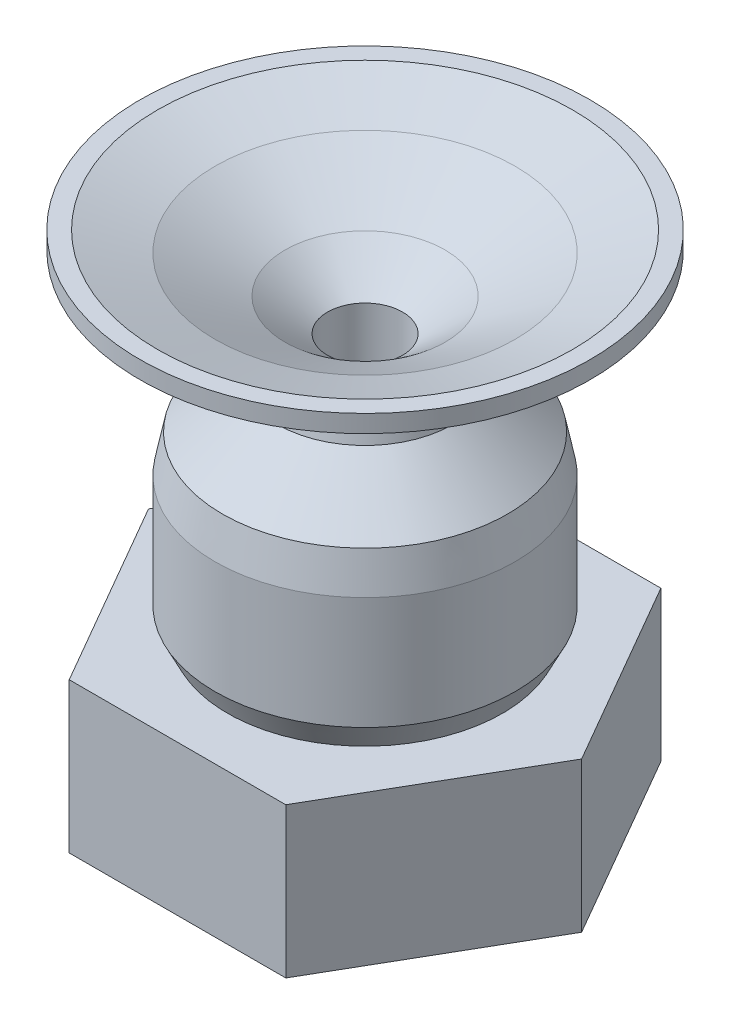
ISO-10303-21;
HEADER;
FILE_DESCRIPTION(('STEP AP214'),'2;1');
FILE_NAME('part.step','',(''),(''),'','','');
FILE_SCHEMA(('AUTOMOTIVE_DESIGN { 1 0 10303 214 1 1 1 1 }'));
ENDSEC;
DATA;
#1=APPLICATION_CONTEXT('core data for automotive mechanical design processes');
#2=APPLICATION_PROTOCOL_DEFINITION('international standard','automotive_design',2000,#1);
#3=PRODUCT_CONTEXT('',#1,'mechanical');
#4=PRODUCT('Part','Part','',(#3));
#5=PRODUCT_RELATED_PRODUCT_CATEGORY('part','',(#4));
#6=PRODUCT_DEFINITION_FORMATION('','',#4);
#7=PRODUCT_DEFINITION_CONTEXT('part definition',#1,'design');
#8=PRODUCT_DEFINITION('design','',#6,#7);
#9=PRODUCT_DEFINITION_SHAPE('','',#8);
#10=(LENGTH_UNIT() NAMED_UNIT(*) SI_UNIT(.MILLI.,.METRE.));
#11=(NAMED_UNIT(*) PLANE_ANGLE_UNIT() SI_UNIT($,.RADIAN.));
#12=(NAMED_UNIT(*) SI_UNIT($,.STERADIAN.) SOLID_ANGLE_UNIT());
#13=UNCERTAINTY_MEASURE_WITH_UNIT(LENGTH_MEASURE(1.E-05),#10,'distance_accuracy_value','');
#14=(GEOMETRIC_REPRESENTATION_CONTEXT(3) GLOBAL_UNCERTAINTY_ASSIGNED_CONTEXT((#13)) GLOBAL_UNIT_ASSIGNED_CONTEXT((#10,
#11,#12)) REPRESENTATION_CONTEXT('',''));
#15=CARTESIAN_POINT('',(0.,0.,0.));
#16=DIRECTION('',(0.,0.,1.));
#17=DIRECTION('',(1.,0.,0.));
#18=AXIS2_PLACEMENT_3D('',#15,#16,#17);
#19=CARTESIAN_POINT('',(0.,0.,0.));
#20=DIRECTION('',(0.,-1.,0.));
#21=DIRECTION('',(0.,0.,-1.));
#22=AXIS2_PLACEMENT_3D('',#19,#20,#21);
#23=CYLINDRICAL_SURFACE('',#22,1.5);
#24=CARTESIAN_POINT('',(0.,6.,0.));
#25=DIRECTION('',(0.,-1.,0.));
#26=DIRECTION('',(0.,0.,-1.));
#27=AXIS2_PLACEMENT_3D('',#24,#25,#26);
#28=CIRCLE('',#27,1.5);
#29=CARTESIAN_POINT('',(0.,6.,-1.5));
#30=VERTEX_POINT('',#29);
#31=EDGE_CURVE('E11',#30,#30,#28,.T.);
#32=ORIENTED_EDGE('',*,*,#31,.T.);
#33=EDGE_LOOP('',(#32));
#34=FACE_BOUND('',#33,.T.);
#35=CARTESIAN_POINT('',(0.,16.4,0.));
#36=DIRECTION('',(0.,-1.,0.));
#37=DIRECTION('',(0.,0.,-1.));
#38=AXIS2_PLACEMENT_3D('',#35,#36,#37);
#39=CIRCLE('',#38,1.5);
#40=CARTESIAN_POINT('',(0.,16.4,-1.5));
#41=VERTEX_POINT('',#40);
#42=EDGE_CURVE('E98',#41,#41,#39,.T.);
#43=ORIENTED_EDGE('',*,*,#42,.F.);
#44=EDGE_LOOP('',(#43));
#45=FACE_BOUND('',#44,.T.);
#46=ADVANCED_FACE('F49',(#34,#45),#23,.F.);
#47=CARTESIAN_POINT('',(1.5,6.,0.));
#48=DIRECTION('',(0.,-1.,0.));
#49=DIRECTION('',(0.,0.,-1.));
#50=AXIS2_PLACEMENT_3D('',#47,#48,#49);
#51=PLANE('',#50);
#52=CARTESIAN_POINT('',(0.,6.,0.));
#53=DIRECTION('',(0.,-1.,0.));
#54=DIRECTION('',(0.,0.,-1.));
#55=AXIS2_PLACEMENT_3D('',#52,#53,#54);
#56=CIRCLE('',#55,5.5);
#57=CARTESIAN_POINT('',(0.,6.,-5.5));
#58=VERTEX_POINT('',#57);
#59=EDGE_CURVE('E55',#58,#58,#56,.T.);
#60=ORIENTED_EDGE('',*,*,#59,.T.);
#61=EDGE_LOOP('',(#60));
#62=FACE_BOUND('',#61,.T.);
#63=ORIENTED_EDGE('',*,*,#31,.F.);
#64=EDGE_LOOP('',(#63));
#65=FACE_BOUND('',#64,.T.);
#66=ADVANCED_FACE('F106',(#62,#65),#51,.T.);
#67=CARTESIAN_POINT('',(0.,6.,0.));
#68=DIRECTION('',(0.,1.,0.));
#69=DIRECTION('',(0.,0.,1.));
#70=AXIS2_PLACEMENT_3D('',#67,#68,#69);
#71=CONICAL_SURFACE('',#70,5.5,0.463647609000806);
#72=CARTESIAN_POINT('',(0.,7.,0.));
#73=DIRECTION('',(0.,-1.,0.));
#74=DIRECTION('',(0.,0.,-1.));
#75=AXIS2_PLACEMENT_3D('',#72,#73,#74);
#76=CIRCLE('',#75,6.);
#77=CARTESIAN_POINT('',(0.,7.,-6.));
#78=VERTEX_POINT('',#77);
#79=EDGE_CURVE('E59',#78,#78,#76,.T.);
#80=ORIENTED_EDGE('',*,*,#79,.T.);
#81=EDGE_LOOP('',(#80));
#82=FACE_BOUND('',#81,.T.);
#83=ORIENTED_EDGE('',*,*,#59,.F.);
#84=EDGE_LOOP('',(#83));
#85=FACE_BOUND('',#84,.T.);
#86=ADVANCED_FACE('F110',(#82,#85),#71,.T.);
#87=CARTESIAN_POINT('',(0.,0.,0.));
#88=DIRECTION('',(0.,-1.,0.));
#89=DIRECTION('',(0.,0.,-1.));
#90=AXIS2_PLACEMENT_3D('',#87,#88,#89);
#91=CYLINDRICAL_SURFACE('',#90,6.);
#92=CARTESIAN_POINT('',(0.,11.5,0.));
#93=DIRECTION('',(0.,-1.,0.));
#94=DIRECTION('',(0.,0.,-1.));
#95=AXIS2_PLACEMENT_3D('',#92,#93,#94);
#96=CIRCLE('',#95,6.);
#97=CARTESIAN_POINT('',(0.,11.5,-6.));
#98=VERTEX_POINT('',#97);
#99=EDGE_CURVE('E63',#98,#98,#96,.T.);
#100=ORIENTED_EDGE('',*,*,#99,.T.);
#101=EDGE_LOOP('',(#100));
#102=FACE_BOUND('',#101,.T.);
#103=ORIENTED_EDGE('',*,*,#79,.F.);
#104=EDGE_LOOP('',(#103));
#105=FACE_BOUND('',#104,.T.);
#106=ADVANCED_FACE('F114',(#102,#105),#91,.T.);
#107=CARTESIAN_POINT('',(0.,11.5,0.));
#108=DIRECTION('',(0.,-1.,0.));
#109=DIRECTION('',(0.,0.,-1.));
#110=AXIS2_PLACEMENT_3D('',#107,#108,#109);
#111=CONICAL_SURFACE('',#110,6.,0.197395559849881);
#112=CARTESIAN_POINT('',(0.,13.,0.));
#113=DIRECTION('',(0.,-1.,0.));
#114=DIRECTION('',(0.,0.,-1.));
#115=AXIS2_PLACEMENT_3D('',#112,#113,#114);
#116=CIRCLE('',#115,5.7);
#117=CARTESIAN_POINT('',(0.,13.,-5.7));
#118=VERTEX_POINT('',#117);
#119=EDGE_CURVE('E68',#118,#118,#116,.T.);
#120=ORIENTED_EDGE('',*,*,#119,.T.);
#121=EDGE_LOOP('',(#120));
#122=FACE_BOUND('',#121,.T.);
#123=ORIENTED_EDGE('',*,*,#99,.F.);
#124=EDGE_LOOP('',(#123));
#125=FACE_BOUND('',#124,.T.);
#126=ADVANCED_FACE('F121',(#122,#125),#111,.T.);
#127=CARTESIAN_POINT('',(0.,13.,0.));
#128=DIRECTION('',(0.,-1.,0.));
#129=DIRECTION('',(0.,0.,-1.));
#130=AXIS2_PLACEMENT_3D('',#127,#128,#129);
#131=CONICAL_SURFACE('',#130,5.7,0.832981266674432);
#132=CARTESIAN_POINT('',(0.,15.,0.));
#133=DIRECTION('',(0.,-1.,0.));
#134=DIRECTION('',(0.,0.,-1.));
#135=AXIS2_PLACEMENT_3D('',#132,#133,#134);
#136=CIRCLE('',#135,3.5);
#137=CARTESIAN_POINT('',(0.,15.,-3.5));
#138=VERTEX_POINT('',#137);
#139=EDGE_CURVE('E71',#138,#138,#136,.T.);
#140=ORIENTED_EDGE('',*,*,#139,.T.);
#141=EDGE_LOOP('',(#140));
#142=FACE_BOUND('',#141,.T.);
#143=ORIENTED_EDGE('',*,*,#119,.F.);
#144=EDGE_LOOP('',(#143));
#145=FACE_BOUND('',#144,.T.);
#146=ADVANCED_FACE('F125',(#142,#145),#131,.T.);
#147=CARTESIAN_POINT('',(0.,15.,0.));
#148=DIRECTION('',(0.,-1.,0.));
#149=DIRECTION('',(0.,0.,-1.));
#150=AXIS2_PLACEMENT_3D('',#147,#148,#149);
#151=CONICAL_SURFACE('',#150,3.5,0.197395559849881);
#152=CARTESIAN_POINT('',(0.,16.,0.));
#153=DIRECTION('',(0.,-1.,0.));
#154=DIRECTION('',(0.,0.,-1.));
#155=AXIS2_PLACEMENT_3D('',#152,#153,#154);
#156=CIRCLE('',#155,3.3);
#157=CARTESIAN_POINT('',(0.,16.,-3.3));
#158=VERTEX_POINT('',#157);
#159=EDGE_CURVE('E74',#158,#158,#156,.T.);
#160=ORIENTED_EDGE('',*,*,#159,.T.);
#161=EDGE_LOOP('',(#160));
#162=FACE_BOUND('',#161,.T.);
#163=ORIENTED_EDGE('',*,*,#139,.F.);
#164=EDGE_LOOP('',(#163));
#165=FACE_BOUND('',#164,.T.);
#166=ADVANCED_FACE('F129',(#162,#165),#151,.T.);
#167=CARTESIAN_POINT('',(0.,16.,0.));
#168=DIRECTION('',(0.,1.,0.));
#169=DIRECTION('',(0.,0.,1.));
#170=AXIS2_PLACEMENT_3D('',#167,#168,#169);
#171=CONICAL_SURFACE('',#170,3.3,0.732815101786507);
#172=CARTESIAN_POINT('',(0.,17.,0.));
#173=DIRECTION('',(0.,-1.,0.));
#174=DIRECTION('',(0.,0.,-1.));
#175=AXIS2_PLACEMENT_3D('',#172,#173,#174);
#176=CIRCLE('',#175,4.2);
#177=CARTESIAN_POINT('',(0.,17.,-4.2));
#178=VERTEX_POINT('',#177);
#179=EDGE_CURVE('E77',#178,#178,#176,.T.);
#180=ORIENTED_EDGE('',*,*,#179,.T.);
#181=EDGE_LOOP('',(#180));
#182=FACE_BOUND('',#181,.T.);
#183=ORIENTED_EDGE('',*,*,#159,.F.);
#184=EDGE_LOOP('',(#183));
#185=FACE_BOUND('',#184,.T.);
#186=ADVANCED_FACE('F133',(#182,#185),#171,.T.);
#187=CARTESIAN_POINT('',(0.,17.,0.));
#188=DIRECTION('',(0.,1.,0.));
#189=DIRECTION('',(0.,0.,1.));
#190=AXIS2_PLACEMENT_3D('',#187,#188,#189);
#191=CONICAL_SURFACE('',#190,4.2,1.03708813515564);
#192=CARTESIAN_POINT('',(0.,18.3,0.));
#193=DIRECTION('',(0.,-1.,0.));
#194=DIRECTION('',(0.,0.,-1.));
#195=AXIS2_PLACEMENT_3D('',#192,#193,#194);
#196=CIRCLE('',#195,6.4);
#197=CARTESIAN_POINT('',(0.,18.3,-6.4));
#198=VERTEX_POINT('',#197);
#199=EDGE_CURVE('E80',#198,#198,#196,.T.);
#200=ORIENTED_EDGE('',*,*,#199,.T.);
#201=EDGE_LOOP('',(#200));
#202=FACE_BOUND('',#201,.T.);
#203=ORIENTED_EDGE('',*,*,#179,.F.);
#204=EDGE_LOOP('',(#203));
#205=FACE_BOUND('',#204,.T.);
#206=ADVANCED_FACE('F137',(#202,#205),#191,.T.);
#207=CARTESIAN_POINT('',(0.,18.3,0.));
#208=DIRECTION('',(0.,1.,0.));
#209=DIRECTION('',(0.,0.,1.));
#210=AXIS2_PLACEMENT_3D('',#207,#208,#209);
#211=CONICAL_SURFACE('',#210,6.4,1.20362249297668);
#212=CARTESIAN_POINT('',(0.,19.3,0.));
#213=DIRECTION('',(0.,-1.,0.));
#214=DIRECTION('',(0.,0.,-1.));
#215=AXIS2_PLACEMENT_3D('',#212,#213,#214);
#216=CIRCLE('',#215,9.);
#217=CARTESIAN_POINT('',(0.,19.3,-9.));
#218=VERTEX_POINT('',#217);
#219=EDGE_CURVE('E83',#218,#218,#216,.T.);
#220=ORIENTED_EDGE('',*,*,#219,.T.);
#221=EDGE_LOOP('',(#220));
#222=FACE_BOUND('',#221,.T.);
#223=ORIENTED_EDGE('',*,*,#199,.F.);
#224=EDGE_LOOP('',(#223));
#225=FACE_BOUND('',#224,.T.);
#226=ADVANCED_FACE('F141',(#222,#225),#211,.T.);
#227=CARTESIAN_POINT('',(0.,0.,0.));
#228=DIRECTION('',(0.,-1.,0.));
#229=DIRECTION('',(0.,0.,-1.));
#230=AXIS2_PLACEMENT_3D('',#227,#228,#229);
#231=CYLINDRICAL_SURFACE('',#230,9.);
#232=CARTESIAN_POINT('',(0.,20.,0.));
#233=DIRECTION('',(0.,-1.,0.));
#234=DIRECTION('',(0.,0.,-1.));
#235=AXIS2_PLACEMENT_3D('',#232,#233,#234);
#236=CIRCLE('',#235,9.);
#237=CARTESIAN_POINT('',(0.,20.,-9.));
#238=VERTEX_POINT('',#237);
#239=EDGE_CURVE('E86',#238,#238,#236,.T.);
#240=ORIENTED_EDGE('',*,*,#239,.T.);
#241=EDGE_LOOP('',(#240));
#242=FACE_BOUND('',#241,.T.);
#243=ORIENTED_EDGE('',*,*,#219,.F.);
#244=EDGE_LOOP('',(#243));
#245=FACE_BOUND('',#244,.T.);
#246=ADVANCED_FACE('F145',(#242,#245),#231,.T.);
#247=CARTESIAN_POINT('',(9.,20.,0.));
#248=DIRECTION('',(0.,1.,0.));
#249=DIRECTION('',(0.,0.,1.));
#250=AXIS2_PLACEMENT_3D('',#247,#248,#249);
#251=PLANE('',#250);
#252=CARTESIAN_POINT('',(0.,20.,0.));
#253=DIRECTION('',(0.,-1.,0.));
#254=DIRECTION('',(0.,0.,-1.));
#255=AXIS2_PLACEMENT_3D('',#252,#253,#254);
#256=CIRCLE('',#255,8.3);
#257=CARTESIAN_POINT('',(0.,20.,-8.3));
#258=VERTEX_POINT('',#257);
#259=EDGE_CURVE('E89',#258,#258,#256,.T.);
#260=ORIENTED_EDGE('',*,*,#259,.T.);
#261=EDGE_LOOP('',(#260));
#262=FACE_BOUND('',#261,.T.);
#263=ORIENTED_EDGE('',*,*,#239,.F.);
#264=EDGE_LOOP('',(#263));
#265=FACE_BOUND('',#264,.T.);
#266=ADVANCED_FACE('F149',(#262,#265),#251,.T.);
#267=CARTESIAN_POINT('',(0.,20.,0.));
#268=DIRECTION('',(0.,1.,0.));
#269=DIRECTION('',(0.,0.,1.));
#270=AXIS2_PLACEMENT_3D('',#267,#268,#269);
#271=CONICAL_SURFACE('',#270,8.3,1.23605948947808);
#272=CARTESIAN_POINT('',(0.,19.2,0.));
#273=DIRECTION('',(0.,-1.,0.));
#274=DIRECTION('',(0.,0.,-1.));
#275=AXIS2_PLACEMENT_3D('',#272,#273,#274);
#276=CIRCLE('',#275,6.);
#277=CARTESIAN_POINT('',(0.,19.2,-6.));
#278=VERTEX_POINT('',#277);
#279=EDGE_CURVE('E92',#278,#278,#276,.T.);
#280=ORIENTED_EDGE('',*,*,#279,.T.);
#281=EDGE_LOOP('',(#280));
#282=FACE_BOUND('',#281,.T.);
#283=ORIENTED_EDGE('',*,*,#259,.F.);
#284=EDGE_LOOP('',(#283));
#285=FACE_BOUND('',#284,.T.);
#286=ADVANCED_FACE('F153',(#282,#285),#271,.F.);
#287=CARTESIAN_POINT('',(0.,19.2,0.));
#288=DIRECTION('',(0.,1.,0.));
#289=DIRECTION('',(0.,0.,1.));
#290=AXIS2_PLACEMENT_3D('',#287,#288,#289);
#291=CONICAL_SURFACE('',#290,6.,1.0789871508062);
#292=CARTESIAN_POINT('',(0.,17.7,0.));
#293=DIRECTION('',(0.,-1.,0.));
#294=DIRECTION('',(0.,0.,-1.));
#295=AXIS2_PLACEMENT_3D('',#292,#293,#294);
#296=CIRCLE('',#295,3.2);
#297=CARTESIAN_POINT('',(0.,17.7,-3.2));
#298=VERTEX_POINT('',#297);
#299=EDGE_CURVE('E95',#298,#298,#296,.T.);
#300=ORIENTED_EDGE('',*,*,#299,.T.);
#301=EDGE_LOOP('',(#300));
#302=FACE_BOUND('',#301,.T.);
#303=ORIENTED_EDGE('',*,*,#279,.F.);
#304=EDGE_LOOP('',(#303));
#305=FACE_BOUND('',#304,.T.);
#306=ADVANCED_FACE('F157',(#302,#305),#291,.F.);
#307=CARTESIAN_POINT('',(0.,17.7,0.));
#308=DIRECTION('',(0.,1.,0.));
#309=DIRECTION('',(0.,0.,1.));
#310=AXIS2_PLACEMENT_3D('',#307,#308,#309);
#311=CONICAL_SURFACE('',#310,3.2,0.917949695694121);
#312=ORIENTED_EDGE('',*,*,#42,.T.);
#313=EDGE_LOOP('',(#312));
#314=FACE_BOUND('',#313,.T.);
#315=ORIENTED_EDGE('',*,*,#299,.F.);
#316=EDGE_LOOP('',(#315));
#317=FACE_BOUND('',#316,.T.);
#318=ADVANCED_FACE('F102',(#314,#317),#311,.F.);
#319=CLOSED_SHELL('',(#46,#66,#86,#106,#126,#146,#166,#186,#206,#226,#246,#266,#286,#306,#318));
#320=MANIFOLD_SOLID_BREP('B2',#319);
#321=CARTESIAN_POINT('',(0.,6.,0.));
#322=DIRECTION('',(0.,1.,0.));
#323=DIRECTION('',(0.,0.,1.));
#324=AXIS2_PLACEMENT_3D('',#321,#322,#323);
#325=PLANE('',#324);
#326=DIRECTION('',(0.5,0.,-0.866025403784439));
#327=VECTOR('',#326,1.);
#328=CARTESIAN_POINT('',(4.33012701892219,6.,7.5));
#329=LINE('',#328,#327);
#330=CARTESIAN_POINT('',(4.33012701892219,6.,7.5));
#331=VERTEX_POINT('',#330);
#332=CARTESIAN_POINT('',(8.66025403784439,6.,0.));
#333=VERTEX_POINT('',#332);
#334=EDGE_CURVE('E372',#331,#333,#329,.T.);
#335=ORIENTED_EDGE('',*,*,#334,.T.);
#336=DIRECTION('',(-0.5,0.,-0.866025403784439));
#337=VECTOR('',#336,1.);
#338=CARTESIAN_POINT('',(8.66025403784439,6.,0.));
#339=LINE('',#338,#337);
#340=CARTESIAN_POINT('',(4.33012701892219,6.,-7.5));
#341=VERTEX_POINT('',#340);
#342=EDGE_CURVE('E330',#333,#341,#339,.T.);
#343=ORIENTED_EDGE('',*,*,#342,.T.);
#344=DIRECTION('',(-1.,0.,0.));
#345=VECTOR('',#344,1.);
#346=CARTESIAN_POINT('',(4.33012701892219,6.,-7.5));
#347=LINE('',#346,#345);
#348=CARTESIAN_POINT('',(-4.33012701892219,6.,-7.5));
#349=VERTEX_POINT('',#348);
#350=EDGE_CURVE('E343',#341,#349,#347,.T.);
#351=ORIENTED_EDGE('',*,*,#350,.T.);
#352=DIRECTION('',(-0.5,0.,0.866025403784439));
#353=VECTOR('',#352,1.);
#354=CARTESIAN_POINT('',(-4.33012701892219,6.,-7.5));
#355=LINE('',#354,#353);
#356=CARTESIAN_POINT('',(-8.66025403784439,6.,0.));
#357=VERTEX_POINT('',#356);
#358=EDGE_CURVE('E337',#349,#357,#355,.T.);
#359=ORIENTED_EDGE('',*,*,#358,.T.);
#360=DIRECTION('',(0.5,0.,0.866025403784439));
#361=VECTOR('',#360,1.);
#362=CARTESIAN_POINT('',(-8.66025403784439,6.,0.));
#363=LINE('',#362,#361);
#364=CARTESIAN_POINT('',(-4.3301270189222,6.,7.5));
#365=VERTEX_POINT('',#364);
#366=EDGE_CURVE('E341',#357,#365,#363,.T.);
#367=ORIENTED_EDGE('',*,*,#366,.T.);
#368=DIRECTION('',(1.,0.,0.));
#369=VECTOR('',#368,1.);
#370=CARTESIAN_POINT('',(-4.3301270189222,6.,7.5));
#371=LINE('',#370,#369);
#372=EDGE_CURVE('E293',#365,#331,#371,.T.);
#373=ORIENTED_EDGE('',*,*,#372,.T.);
#374=EDGE_LOOP('',(#335,#343,#351,#359,#367,#373));
#375=FACE_BOUND('',#374,.T.);
#376=CARTESIAN_POINT('',(0.,6.,0.));
#377=DIRECTION('',(0.,1.,0.));
#378=DIRECTION('',(0.,0.,1.));
#379=AXIS2_PLACEMENT_3D('',#376,#377,#378);
#380=CIRCLE('',#379,1.5);
#381=CARTESIAN_POINT('',(0.,6.,1.5));
#382=VERTEX_POINT('',#381);
#383=EDGE_CURVE('E365',#382,#382,#380,.T.);
#384=ORIENTED_EDGE('',*,*,#383,.F.);
#385=EDGE_LOOP('',(#384));
#386=FACE_BOUND('',#385,.T.);
#387=ADVANCED_FACE('F276',(#375,#386),#325,.T.);
#388=CARTESIAN_POINT('',(0.,0.,0.));
#389=DIRECTION('',(0.,1.,0.));
#390=DIRECTION('',(0.,0.,1.));
#391=AXIS2_PLACEMENT_3D('',#388,#389,#390);
#392=PLANE('',#391);
#393=DIRECTION('',(0.5,0.,-0.866025403784439));
#394=VECTOR('',#393,1.);
#395=CARTESIAN_POINT('',(4.33012701892219,0.,7.5));
#396=LINE('',#395,#394);
#397=CARTESIAN_POINT('',(4.33012701892219,0.,7.5));
#398=VERTEX_POINT('',#397);
#399=CARTESIAN_POINT('',(8.66025403784439,0.,0.));
#400=VERTEX_POINT('',#399);
#401=EDGE_CURVE('E361',#398,#400,#396,.T.);
#402=ORIENTED_EDGE('',*,*,#401,.F.);
#403=DIRECTION('',(1.,0.,0.));
#404=VECTOR('',#403,1.);
#405=CARTESIAN_POINT('',(-4.3301270189222,0.,7.5));
#406=LINE('',#405,#404);
#407=CARTESIAN_POINT('',(-4.3301270189222,0.,7.5));
#408=VERTEX_POINT('',#407);
#409=EDGE_CURVE('E322',#408,#398,#406,.T.);
#410=ORIENTED_EDGE('',*,*,#409,.F.);
#411=DIRECTION('',(0.5,0.,0.866025403784439));
#412=VECTOR('',#411,1.);
#413=CARTESIAN_POINT('',(-8.66025403784439,0.,0.));
#414=LINE('',#413,#412);
#415=CARTESIAN_POINT('',(-8.66025403784439,0.,0.));
#416=VERTEX_POINT('',#415);
#417=EDGE_CURVE('E316',#416,#408,#414,.T.);
#418=ORIENTED_EDGE('',*,*,#417,.F.);
#419=DIRECTION('',(-0.5,0.,0.866025403784439));
#420=VECTOR('',#419,1.);
#421=CARTESIAN_POINT('',(-4.33012701892219,0.,-7.5));
#422=LINE('',#421,#420);
#423=CARTESIAN_POINT('',(-4.33012701892219,0.,-7.5));
#424=VERTEX_POINT('',#423);
#425=EDGE_CURVE('E351',#424,#416,#422,.T.);
#426=ORIENTED_EDGE('',*,*,#425,.F.);
#427=DIRECTION('',(-1.,0.,0.));
#428=VECTOR('',#427,1.);
#429=CARTESIAN_POINT('',(4.33012701892219,0.,-7.5));
#430=LINE('',#429,#428);
#431=CARTESIAN_POINT('',(4.33012701892219,0.,-7.5));
#432=VERTEX_POINT('',#431);
#433=EDGE_CURVE('E367',#432,#424,#430,.T.);
#434=ORIENTED_EDGE('',*,*,#433,.F.);
#435=DIRECTION('',(-0.5,0.,-0.866025403784439));
#436=VECTOR('',#435,1.);
#437=CARTESIAN_POINT('',(8.66025403784439,0.,0.));
#438=LINE('',#437,#436);
#439=EDGE_CURVE('E364',#400,#432,#438,.T.);
#440=ORIENTED_EDGE('',*,*,#439,.F.);
#441=EDGE_LOOP('',(#402,#410,#418,#426,#434,#440));
#442=FACE_BOUND('',#441,.T.);
#443=CARTESIAN_POINT('',(0.,0.,0.));
#444=DIRECTION('',(0.,1.,0.));
#445=DIRECTION('',(0.,0.,1.));
#446=AXIS2_PLACEMENT_3D('',#443,#444,#445);
#447=CIRCLE('',#446,1.5);
#448=CARTESIAN_POINT('',(0.,0.,1.5));
#449=VERTEX_POINT('',#448);
#450=EDGE_CURVE('E465',#449,#449,#447,.T.);
#451=ORIENTED_EDGE('',*,*,#450,.T.);
#452=EDGE_LOOP('',(#451));
#453=FACE_BOUND('',#452,.T.);
#454=ADVANCED_FACE('F381',(#442,#453),#392,.F.);
#455=CARTESIAN_POINT('',(4.33012701892219,6.,7.5));
#456=DIRECTION('',(-0.866025403784439,0.,-0.5));
#457=DIRECTION('',(-0.5,0.,0.866025403784439));
#458=AXIS2_PLACEMENT_3D('',#455,#456,#457);
#459=PLANE('',#458);
#460=ORIENTED_EDGE('',*,*,#401,.T.);
#461=DIRECTION('',(0.,-1.,0.));
#462=VECTOR('',#461,1.);
#463=CARTESIAN_POINT('',(8.66025403784439,6.,0.));
#464=LINE('',#463,#462);
#465=EDGE_CURVE('E47',#333,#400,#464,.T.);
#466=ORIENTED_EDGE('',*,*,#465,.F.);
#467=ORIENTED_EDGE('',*,*,#334,.F.);
#468=DIRECTION('',(0.,-1.,0.));
#469=VECTOR('',#468,1.);
#470=CARTESIAN_POINT('',(4.33012701892219,6.,7.5));
#471=LINE('',#470,#469);
#472=EDGE_CURVE('E357',#331,#398,#471,.T.);
#473=ORIENTED_EDGE('',*,*,#472,.T.);
#474=EDGE_LOOP('',(#460,#466,#467,#473));
#475=FACE_BOUND('',#474,.T.);
#476=ADVANCED_FACE('F278',(#475),#459,.F.);
#477=CARTESIAN_POINT('',(8.66025403784439,6.,0.));
#478=DIRECTION('',(-0.866025403784439,0.,0.5));
#479=DIRECTION('',(0.5,0.,0.866025403784439));
#480=AXIS2_PLACEMENT_3D('',#477,#478,#479);
#481=PLANE('',#480);
#482=ORIENTED_EDGE('',*,*,#439,.T.);
#483=DIRECTION('',(0.,-1.,0.));
#484=VECTOR('',#483,1.);
#485=CARTESIAN_POINT('',(4.33012701892219,6.,-7.5));
#486=LINE('',#485,#484);
#487=EDGE_CURVE('E285',#341,#432,#486,.T.);
#488=ORIENTED_EDGE('',*,*,#487,.F.);
#489=ORIENTED_EDGE('',*,*,#342,.F.);
#490=ORIENTED_EDGE('',*,*,#465,.T.);
#491=EDGE_LOOP('',(#482,#488,#489,#490));
#492=FACE_BOUND('',#491,.T.);
#493=ADVANCED_FACE('F406',(#492),#481,.F.);
#494=CARTESIAN_POINT('',(4.33012701892219,6.,-7.5));
#495=DIRECTION('',(0.,0.,1.));
#496=DIRECTION('',(1.,0.,0.));
#497=AXIS2_PLACEMENT_3D('',#494,#495,#496);
#498=PLANE('',#497);
#499=ORIENTED_EDGE('',*,*,#433,.T.);
#500=DIRECTION('',(0.,-1.,0.));
#501=VECTOR('',#500,1.);
#502=CARTESIAN_POINT('',(-4.33012701892219,6.,-7.5));
#503=LINE('',#502,#501);
#504=EDGE_CURVE('E352',#349,#424,#503,.T.);
#505=ORIENTED_EDGE('',*,*,#504,.F.);
#506=ORIENTED_EDGE('',*,*,#350,.F.);
#507=ORIENTED_EDGE('',*,*,#487,.T.);
#508=EDGE_LOOP('',(#499,#505,#506,#507));
#509=FACE_BOUND('',#508,.T.);
#510=ADVANCED_FACE('F378',(#509),#498,.F.);
#511=CARTESIAN_POINT('',(-4.33012701892219,6.,-7.5));
#512=DIRECTION('',(0.866025403784438,0.,0.5));
#513=DIRECTION('',(0.5,0.,-0.866025403784439));
#514=AXIS2_PLACEMENT_3D('',#511,#512,#513);
#515=PLANE('',#514);
#516=ORIENTED_EDGE('',*,*,#425,.T.);
#517=DIRECTION('',(0.,-1.,0.));
#518=VECTOR('',#517,1.);
#519=CARTESIAN_POINT('',(-8.66025403784439,6.,0.));
#520=LINE('',#519,#518);
#521=EDGE_CURVE('E348',#357,#416,#520,.T.);
#522=ORIENTED_EDGE('',*,*,#521,.F.);
#523=ORIENTED_EDGE('',*,*,#358,.F.);
#524=ORIENTED_EDGE('',*,*,#504,.T.);
#525=EDGE_LOOP('',(#516,#522,#523,#524));
#526=FACE_BOUND('',#525,.T.);
#527=ADVANCED_FACE('F349',(#526),#515,.F.);
#528=CARTESIAN_POINT('',(-8.66025403784439,6.,0.));
#529=DIRECTION('',(0.866025403784439,0.,-0.5));
#530=DIRECTION('',(-0.5,0.,-0.866025403784439));
#531=AXIS2_PLACEMENT_3D('',#528,#529,#530);
#532=PLANE('',#531);
#533=ORIENTED_EDGE('',*,*,#417,.T.);
#534=DIRECTION('',(0.,-1.,0.));
#535=VECTOR('',#534,1.);
#536=CARTESIAN_POINT('',(-4.3301270189222,6.,7.5));
#537=LINE('',#536,#535);
#538=EDGE_CURVE('E353',#365,#408,#537,.T.);
#539=ORIENTED_EDGE('',*,*,#538,.F.);
#540=ORIENTED_EDGE('',*,*,#366,.F.);
#541=ORIENTED_EDGE('',*,*,#521,.T.);
#542=EDGE_LOOP('',(#533,#539,#540,#541));
#543=FACE_BOUND('',#542,.T.);
#544=ADVANCED_FACE('F355',(#543),#532,.F.);
#545=CARTESIAN_POINT('',(-4.3301270189222,6.,7.5));
#546=DIRECTION('',(0.,0.,-1.));
#547=DIRECTION('',(-1.,0.,0.));
#548=AXIS2_PLACEMENT_3D('',#545,#546,#547);
#549=PLANE('',#548);
#550=ORIENTED_EDGE('',*,*,#409,.T.);
#551=ORIENTED_EDGE('',*,*,#472,.F.);
#552=ORIENTED_EDGE('',*,*,#372,.F.);
#553=ORIENTED_EDGE('',*,*,#538,.T.);
#554=EDGE_LOOP('',(#550,#551,#552,#553));
#555=FACE_BOUND('',#554,.T.);
#556=ADVANCED_FACE('F386',(#555),#549,.F.);
#557=CARTESIAN_POINT('',(0.,6.,0.));
#558=DIRECTION('',(0.,-1.,0.));
#559=DIRECTION('',(0.,0.,-1.));
#560=AXIS2_PLACEMENT_3D('',#557,#558,#559);
#561=CYLINDRICAL_SURFACE('',#560,1.5);
#562=ORIENTED_EDGE('',*,*,#383,.T.);
#563=EDGE_LOOP('',(#562));
#564=FACE_BOUND('',#563,.T.);
#565=ORIENTED_EDGE('',*,*,#450,.F.);
#566=EDGE_LOOP('',(#565));
#567=FACE_BOUND('',#566,.T.);
#568=ADVANCED_FACE('F388',(#564,#567),#561,.F.);
#569=CLOSED_SHELL('',(#387,#454,#476,#493,#510,#527,#544,#556,#568));
#570=MANIFOLD_SOLID_BREP('B6',#569);
#571=ADVANCED_BREP_SHAPE_REPRESENTATION('',(#18,#320,#570),#14);
#572=SHAPE_DEFINITION_REPRESENTATION(#9,#571);
ENDSEC;
END-ISO-10303-21;
